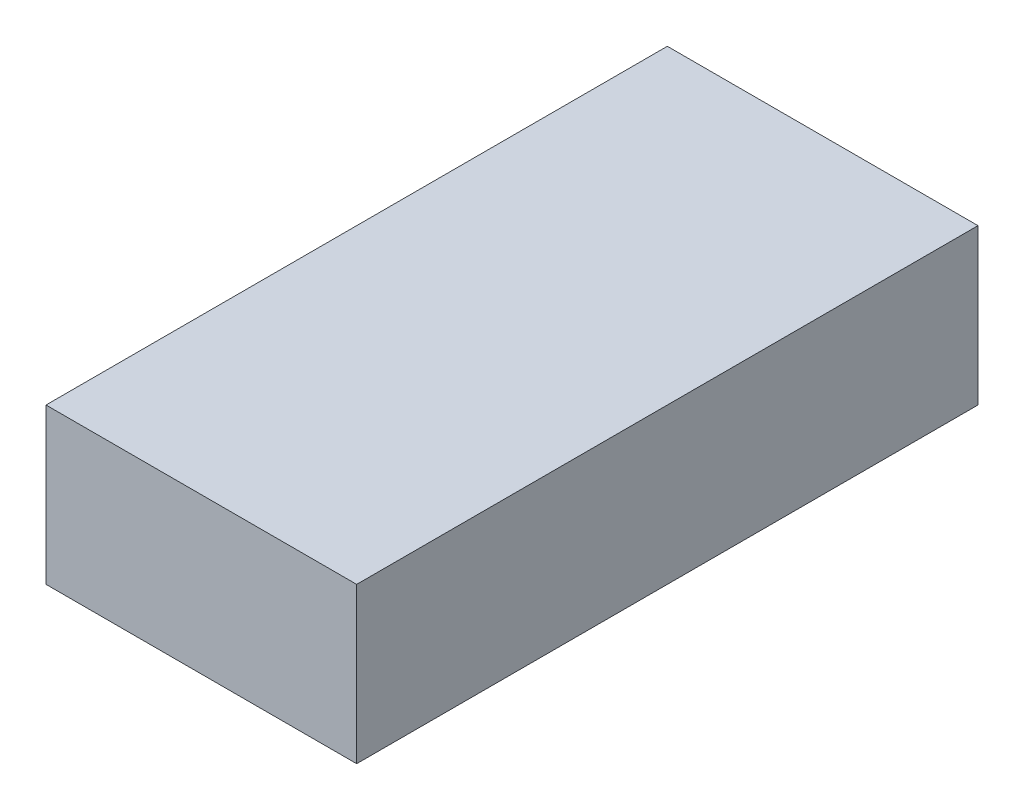
ISO-10303-21;
HEADER;
FILE_DESCRIPTION(('STEP AP214'),'2;1');
FILE_NAME('part.step','',(''),(''),'','','');
FILE_SCHEMA(('AUTOMOTIVE_DESIGN { 1 0 10303 214 1 1 1 1 }'));
ENDSEC;
DATA;
#1=APPLICATION_CONTEXT('core data for automotive mechanical design processes');
#2=APPLICATION_PROTOCOL_DEFINITION('international standard','automotive_design',2000,#1);
#3=PRODUCT_CONTEXT('',#1,'mechanical');
#4=PRODUCT('Part','Part','',(#3));
#5=PRODUCT_RELATED_PRODUCT_CATEGORY('part','',(#4));
#6=PRODUCT_DEFINITION_FORMATION('','',#4);
#7=PRODUCT_DEFINITION_CONTEXT('part definition',#1,'design');
#8=PRODUCT_DEFINITION('design','',#6,#7);
#9=PRODUCT_DEFINITION_SHAPE('','',#8);
#10=(LENGTH_UNIT() NAMED_UNIT(*) SI_UNIT(.MILLI.,.METRE.));
#11=(NAMED_UNIT(*) PLANE_ANGLE_UNIT() SI_UNIT($,.RADIAN.));
#12=(NAMED_UNIT(*) SI_UNIT($,.STERADIAN.) SOLID_ANGLE_UNIT());
#13=UNCERTAINTY_MEASURE_WITH_UNIT(LENGTH_MEASURE(1.E-05),#10,'distance_accuracy_value','');
#14=(GEOMETRIC_REPRESENTATION_CONTEXT(3) GLOBAL_UNCERTAINTY_ASSIGNED_CONTEXT((#13)) GLOBAL_UNIT_ASSIGNED_CONTEXT((#10,
#11,#12)) REPRESENTATION_CONTEXT('',''));
#15=CARTESIAN_POINT('',(0.,0.,0.));
#16=DIRECTION('',(0.,0.,1.));
#17=DIRECTION('',(1.,0.,0.));
#18=AXIS2_PLACEMENT_3D('',#15,#16,#17);
#19=CARTESIAN_POINT('',(0.,0.,25.4));
#20=DIRECTION('',(-1.,0.,0.));
#21=DIRECTION('',(0.,-1.,0.));
#22=AXIS2_PLACEMENT_3D('',#19,#20,#21);
#23=PLANE('',#22);
#24=DIRECTION('',(0.,1.,0.));
#25=VECTOR('',#24,1.);
#26=CARTESIAN_POINT('',(0.,0.,0.));
#27=LINE('',#26,#25);
#28=CARTESIAN_POINT('',(0.,0.,0.));
#29=VERTEX_POINT('',#28);
#30=CARTESIAN_POINT('',(0.,6.35,0.));
#31=VERTEX_POINT('',#30);
#32=EDGE_CURVE('E113',#29,#31,#27,.T.);
#33=ORIENTED_EDGE('',*,*,#32,.T.);
#34=DIRECTION('',(0.,0.,-1.));
#35=VECTOR('',#34,1.);
#36=CARTESIAN_POINT('',(0.,6.35,25.4));
#37=LINE('',#36,#35);
#38=CARTESIAN_POINT('',(0.,6.35,25.4));
#39=VERTEX_POINT('',#38);
#40=EDGE_CURVE('E11',#39,#31,#37,.T.);
#41=ORIENTED_EDGE('',*,*,#40,.F.);
#42=DIRECTION('',(0.,1.,0.));
#43=VECTOR('',#42,1.);
#44=CARTESIAN_POINT('',(0.,0.,25.4));
#45=LINE('',#44,#43);
#46=CARTESIAN_POINT('',(0.,0.,25.4));
#47=VERTEX_POINT('',#46);
#48=EDGE_CURVE('E97',#47,#39,#45,.T.);
#49=ORIENTED_EDGE('',*,*,#48,.F.);
#50=DIRECTION('',(0.,0.,-1.));
#51=VECTOR('',#50,1.);
#52=CARTESIAN_POINT('',(0.,0.,25.4));
#53=LINE('',#52,#51);
#54=EDGE_CURVE('E109',#47,#29,#53,.T.);
#55=ORIENTED_EDGE('',*,*,#54,.T.);
#56=EDGE_LOOP('',(#33,#41,#49,#55));
#57=FACE_BOUND('',#56,.T.);
#58=ADVANCED_FACE('F45',(#57),#23,.F.);
#59=CARTESIAN_POINT('',(0.,6.35,25.4));
#60=DIRECTION('',(0.,-1.,0.));
#61=DIRECTION('',(1.,0.,0.));
#62=AXIS2_PLACEMENT_3D('',#59,#60,#61);
#63=PLANE('',#62);
#64=DIRECTION('',(-1.,0.,0.));
#65=VECTOR('',#64,1.);
#66=CARTESIAN_POINT('',(0.,6.35,0.));
#67=LINE('',#66,#65);
#68=CARTESIAN_POINT('',(-12.7,6.35,0.));
#69=VERTEX_POINT('',#68);
#70=EDGE_CURVE('E102',#31,#69,#67,.T.);
#71=ORIENTED_EDGE('',*,*,#70,.T.);
#72=DIRECTION('',(0.,0.,-1.));
#73=VECTOR('',#72,1.);
#74=CARTESIAN_POINT('',(-12.7,6.35,25.4));
#75=LINE('',#74,#73);
#76=CARTESIAN_POINT('',(-12.7,6.35,25.4));
#77=VERTEX_POINT('',#76);
#78=EDGE_CURVE('E54',#77,#69,#75,.T.);
#79=ORIENTED_EDGE('',*,*,#78,.F.);
#80=DIRECTION('',(-1.,0.,0.));
#81=VECTOR('',#80,1.);
#82=CARTESIAN_POINT('',(0.,6.35,25.4));
#83=LINE('',#82,#81);
#84=EDGE_CURVE('E92',#39,#77,#83,.T.);
#85=ORIENTED_EDGE('',*,*,#84,.F.);
#86=ORIENTED_EDGE('',*,*,#40,.T.);
#87=EDGE_LOOP('',(#71,#79,#85,#86));
#88=FACE_BOUND('',#87,.T.);
#89=ADVANCED_FACE('F101',(#88),#63,.F.);
#90=CARTESIAN_POINT('',(-12.7,0.,25.4));
#91=DIRECTION('',(1.,0.,0.));
#92=DIRECTION('',(0.,0.,-1.));
#93=AXIS2_PLACEMENT_3D('',#90,#91,#92);
#94=PLANE('',#93);
#95=DIRECTION('',(0.,-1.,0.));
#96=VECTOR('',#95,1.);
#97=CARTESIAN_POINT('',(-12.7,0.,0.));
#98=LINE('',#97,#96);
#99=CARTESIAN_POINT('',(-12.7,0.,0.));
#100=VERTEX_POINT('',#99);
#101=EDGE_CURVE('E79',#69,#100,#98,.T.);
#102=ORIENTED_EDGE('',*,*,#101,.T.);
#103=DIRECTION('',(0.,0.,-1.));
#104=VECTOR('',#103,1.);
#105=CARTESIAN_POINT('',(-12.7,0.,25.4));
#106=LINE('',#105,#104);
#107=CARTESIAN_POINT('',(-12.7,0.,25.4));
#108=VERTEX_POINT('',#107);
#109=EDGE_CURVE('E104',#108,#100,#106,.T.);
#110=ORIENTED_EDGE('',*,*,#109,.F.);
#111=DIRECTION('',(0.,-1.,0.));
#112=VECTOR('',#111,1.);
#113=CARTESIAN_POINT('',(-12.7,0.,25.4));
#114=LINE('',#113,#112);
#115=EDGE_CURVE('E95',#77,#108,#114,.T.);
#116=ORIENTED_EDGE('',*,*,#115,.F.);
#117=ORIENTED_EDGE('',*,*,#78,.T.);
#118=EDGE_LOOP('',(#102,#110,#116,#117));
#119=FACE_BOUND('',#118,.T.);
#120=ADVANCED_FACE('F105',(#119),#94,.F.);
#121=CARTESIAN_POINT('',(0.,0.,25.4));
#122=DIRECTION('',(0.,1.,0.));
#123=DIRECTION('',(0.,0.,1.));
#124=AXIS2_PLACEMENT_3D('',#121,#122,#123);
#125=PLANE('',#124);
#126=DIRECTION('',(1.,0.,0.));
#127=VECTOR('',#126,1.);
#128=CARTESIAN_POINT('',(0.,0.,0.));
#129=LINE('',#128,#127);
#130=EDGE_CURVE('E85',#100,#29,#129,.T.);
#131=ORIENTED_EDGE('',*,*,#130,.T.);
#132=ORIENTED_EDGE('',*,*,#54,.F.);
#133=DIRECTION('',(1.,0.,0.));
#134=VECTOR('',#133,1.);
#135=CARTESIAN_POINT('',(0.,0.,25.4));
#136=LINE('',#135,#134);
#137=EDGE_CURVE('E62',#108,#47,#136,.T.);
#138=ORIENTED_EDGE('',*,*,#137,.F.);
#139=ORIENTED_EDGE('',*,*,#109,.T.);
#140=EDGE_LOOP('',(#131,#132,#138,#139));
#141=FACE_BOUND('',#140,.T.);
#142=ADVANCED_FACE('F126',(#141),#125,.F.);
#143=CARTESIAN_POINT('',(0.,0.,25.4));
#144=DIRECTION('',(0.,0.,1.));
#145=DIRECTION('',(1.,0.,0.));
#146=AXIS2_PLACEMENT_3D('',#143,#144,#145);
#147=PLANE('',#146);
#148=ORIENTED_EDGE('',*,*,#48,.T.);
#149=ORIENTED_EDGE('',*,*,#84,.T.);
#150=ORIENTED_EDGE('',*,*,#115,.T.);
#151=ORIENTED_EDGE('',*,*,#137,.T.);
#152=EDGE_LOOP('',(#148,#149,#150,#151));
#153=FACE_BOUND('',#152,.T.);
#154=ADVANCED_FACE('F93',(#153),#147,.T.);
#155=CARTESIAN_POINT('',(0.,0.,0.));
#156=DIRECTION('',(0.,0.,1.));
#157=DIRECTION('',(1.,0.,0.));
#158=AXIS2_PLACEMENT_3D('',#155,#156,#157);
#159=PLANE('',#158);
#160=ORIENTED_EDGE('',*,*,#32,.F.);
#161=ORIENTED_EDGE('',*,*,#130,.F.);
#162=ORIENTED_EDGE('',*,*,#101,.F.);
#163=ORIENTED_EDGE('',*,*,#70,.F.);
#164=EDGE_LOOP('',(#160,#161,#162,#163));
#165=FACE_BOUND('',#164,.T.);
#166=ADVANCED_FACE('F129',(#165),#159,.F.);
#167=CLOSED_SHELL('',(#58,#89,#120,#142,#154,#166));
#168=MANIFOLD_SOLID_BREP('B2',#167);
#169=ADVANCED_BREP_SHAPE_REPRESENTATION('',(#18,#168),#14);
#170=SHAPE_DEFINITION_REPRESENTATION(#9,#169);
ENDSEC;
END-ISO-10303-21;
